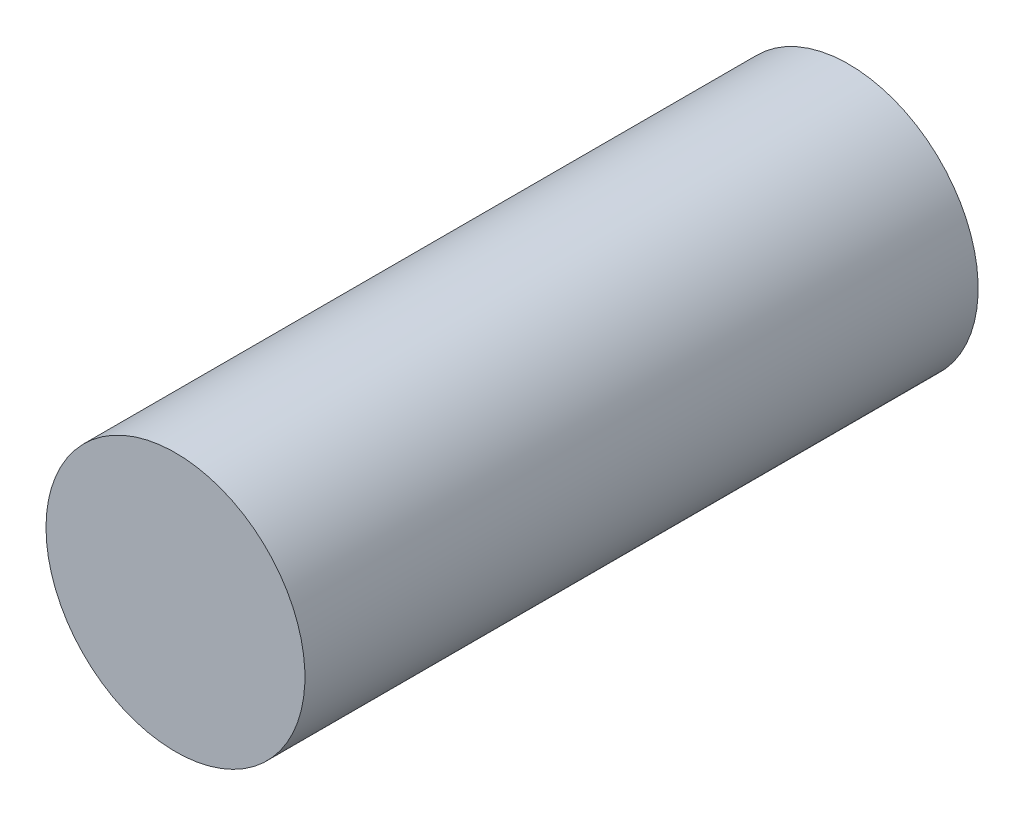
ISO-10303-21;
HEADER;
FILE_DESCRIPTION(('STEP AP214'),'2;1');
FILE_NAME('part.step','',(''),(''),'','','');
FILE_SCHEMA(('AUTOMOTIVE_DESIGN { 1 0 10303 214 1 1 1 1 }'));
ENDSEC;
DATA;
#1=APPLICATION_CONTEXT('core data for automotive mechanical design processes');
#2=APPLICATION_PROTOCOL_DEFINITION('international standard','automotive_design',2000,#1);
#3=PRODUCT_CONTEXT('',#1,'mechanical');
#4=PRODUCT('Part','Part','',(#3));
#5=PRODUCT_RELATED_PRODUCT_CATEGORY('part','',(#4));
#6=PRODUCT_DEFINITION_FORMATION('','',#4);
#7=PRODUCT_DEFINITION_CONTEXT('part definition',#1,'design');
#8=PRODUCT_DEFINITION('design','',#6,#7);
#9=PRODUCT_DEFINITION_SHAPE('','',#8);
#10=(LENGTH_UNIT() NAMED_UNIT(*) SI_UNIT(.MILLI.,.METRE.));
#11=(NAMED_UNIT(*) PLANE_ANGLE_UNIT() SI_UNIT($,.RADIAN.));
#12=(NAMED_UNIT(*) SI_UNIT($,.STERADIAN.) SOLID_ANGLE_UNIT());
#13=UNCERTAINTY_MEASURE_WITH_UNIT(LENGTH_MEASURE(1.E-05),#10,'distance_accuracy_value','');
#14=(GEOMETRIC_REPRESENTATION_CONTEXT(3) GLOBAL_UNCERTAINTY_ASSIGNED_CONTEXT((#13)) GLOBAL_UNIT_ASSIGNED_CONTEXT((#10,
#11,#12)) REPRESENTATION_CONTEXT('',''));
#15=CARTESIAN_POINT('',(0.,0.,0.));
#16=DIRECTION('',(0.,0.,1.));
#17=DIRECTION('',(1.,0.,0.));
#18=AXIS2_PLACEMENT_3D('',#15,#16,#17);
#19=CARTESIAN_POINT('',(0.,0.,13.));
#20=DIRECTION('',(0.,0.,-1.));
#21=DIRECTION('',(-1.,0.,0.));
#22=AXIS2_PLACEMENT_3D('',#19,#20,#21);
#23=CYLINDRICAL_SURFACE('',#22,2.5);
#24=CARTESIAN_POINT('',(0.,0.,13.));
#25=DIRECTION('',(0.,0.,1.));
#26=DIRECTION('',(1.,0.,0.));
#27=AXIS2_PLACEMENT_3D('',#24,#25,#26);
#28=CIRCLE('',#27,2.5);
#29=CARTESIAN_POINT('',(-2.5,0.,13.));
#30=VERTEX_POINT('',#29);
#31=EDGE_CURVE('E10',#30,#30,#28,.T.);
#32=CARTESIAN_POINT('',(0.,0.,0.));
#33=DIRECTION('',(0.,0.,1.));
#34=DIRECTION('',(1.,0.,0.));
#35=AXIS2_PLACEMENT_3D('',#32,#33,#34);
#36=CIRCLE('',#35,2.5);
#37=CARTESIAN_POINT('',(-2.5,0.,0.));
#38=VERTEX_POINT('',#37);
#39=EDGE_CURVE('E42',#38,#38,#36,.T.);
#40=CARTESIAN_POINT('',(-2.5,0.,13.));
#41=CARTESIAN_POINT('',(-2.5,0.,12.8645833333333));
#42=CARTESIAN_POINT('',(-2.5,0.,12.7291666666667));
#43=CARTESIAN_POINT('',(-2.5,0.,12.4583333333333));
#44=CARTESIAN_POINT('',(-2.5,0.,12.3229166666667));
#45=CARTESIAN_POINT('',(-2.5,0.,12.0520833333333));
#46=CARTESIAN_POINT('',(-2.5,0.,11.9166666666667));
#47=CARTESIAN_POINT('',(-2.5,0.,11.6458333333333));
#48=CARTESIAN_POINT('',(-2.5,0.,11.5104166666667));
#49=CARTESIAN_POINT('',(-2.5,0.,11.2395833333333));
#50=CARTESIAN_POINT('',(-2.5,0.,11.1041666666667));
#51=CARTESIAN_POINT('',(-2.5,0.,10.8333333333333));
#52=CARTESIAN_POINT('',(-2.5,0.,10.6979166666667));
#53=CARTESIAN_POINT('',(-2.5,0.,10.4270833333333));
#54=CARTESIAN_POINT('',(-2.5,0.,10.2916666666667));
#55=CARTESIAN_POINT('',(-2.5,0.,10.0208333333333));
#56=CARTESIAN_POINT('',(-2.5,0.,9.88541666666667));
#57=CARTESIAN_POINT('',(-2.5,0.,9.61458333333333));
#58=CARTESIAN_POINT('',(-2.5,0.,9.47916666666667));
#59=CARTESIAN_POINT('',(-2.5,0.,9.20833333333333));
#60=CARTESIAN_POINT('',(-2.5,0.,9.07291666666667));
#61=CARTESIAN_POINT('',(-2.5,0.,8.80208333333333));
#62=CARTESIAN_POINT('',(-2.5,0.,8.66666666666667));
#63=CARTESIAN_POINT('',(-2.5,0.,8.39583333333333));
#64=CARTESIAN_POINT('',(-2.5,0.,8.26041666666667));
#65=CARTESIAN_POINT('',(-2.5,0.,7.98958333333333));
#66=CARTESIAN_POINT('',(-2.5,0.,7.85416666666667));
#67=CARTESIAN_POINT('',(-2.5,0.,7.58333333333333));
#68=CARTESIAN_POINT('',(-2.5,0.,7.44791666666667));
#69=CARTESIAN_POINT('',(-2.5,0.,7.17708333333333));
#70=CARTESIAN_POINT('',(-2.5,0.,7.04166666666667));
#71=CARTESIAN_POINT('',(-2.5,0.,6.77083333333333));
#72=CARTESIAN_POINT('',(-2.5,0.,6.63541666666667));
#73=CARTESIAN_POINT('',(-2.5,0.,6.36458333333333));
#74=CARTESIAN_POINT('',(-2.5,0.,6.22916666666667));
#75=CARTESIAN_POINT('',(-2.5,0.,5.95833333333333));
#76=CARTESIAN_POINT('',(-2.5,0.,5.82291666666667));
#77=CARTESIAN_POINT('',(-2.5,0.,5.55208333333333));
#78=CARTESIAN_POINT('',(-2.5,0.,5.41666666666667));
#79=CARTESIAN_POINT('',(-2.5,0.,5.14583333333333));
#80=CARTESIAN_POINT('',(-2.5,0.,5.01041666666667));
#81=CARTESIAN_POINT('',(-2.5,0.,4.73958333333333));
#82=CARTESIAN_POINT('',(-2.5,0.,4.60416666666667));
#83=CARTESIAN_POINT('',(-2.5,0.,4.33333333333333));
#84=CARTESIAN_POINT('',(-2.5,0.,4.19791666666667));
#85=CARTESIAN_POINT('',(-2.5,0.,3.92708333333333));
#86=CARTESIAN_POINT('',(-2.5,0.,3.79166666666667));
#87=CARTESIAN_POINT('',(-2.5,0.,3.52083333333333));
#88=CARTESIAN_POINT('',(-2.5,0.,3.38541666666667));
#89=CARTESIAN_POINT('',(-2.5,0.,3.11458333333333));
#90=CARTESIAN_POINT('',(-2.5,0.,2.97916666666667));
#91=CARTESIAN_POINT('',(-2.5,0.,2.70833333333333));
#92=CARTESIAN_POINT('',(-2.5,0.,2.57291666666667));
#93=CARTESIAN_POINT('',(-2.5,0.,2.30208333333333));
#94=CARTESIAN_POINT('',(-2.5,0.,2.16666666666667));
#95=CARTESIAN_POINT('',(-2.5,0.,1.89583333333333));
#96=CARTESIAN_POINT('',(-2.5,0.,1.76041666666667));
#97=CARTESIAN_POINT('',(-2.5,0.,1.48958333333333));
#98=CARTESIAN_POINT('',(-2.5,0.,1.35416666666667));
#99=CARTESIAN_POINT('',(-2.5,0.,1.08333333333333));
#100=CARTESIAN_POINT('',(-2.5,0.,0.947916666666667));
#101=CARTESIAN_POINT('',(-2.5,0.,0.677083333333334));
#102=CARTESIAN_POINT('',(-2.5,0.,0.541666666666667));
#103=CARTESIAN_POINT('',(-2.5,0.,0.270833333333334));
#104=CARTESIAN_POINT('',(-2.5,0.,0.135416666666667));
#105=CARTESIAN_POINT('',(-2.5,0.,0.));
#106=B_SPLINE_CURVE_WITH_KNOTS('',3,(#40,#41,#42,#43,#44,#45,#46,#47,#48,#49,#50,#51,#52,#53,
#54,#55,#56,#57,#58,#59,#60,#61,#62,#63,#64,#65,#66,#67,#68,#69,#70,#71,#72,#73,#74,#75,#76,#77,
#78,#79,#80,#81,#82,#83,#84,#85,#86,#87,#88,#89,#90,#91,#92,#93,#94,#95,#96,#97,#98,#99,#100,
#101,#102,#103,#104,#105),.UNSPECIFIED.,.F.,.F.,(4,2,2,2,2,2,2,2,2,2,2,2,2,2,2,2,2,2,2,2,2,2,2,
2,2,2,2,2,2,2,2,2,4),(0.,0.406249999999999,0.812499999999999,1.21875,1.625,2.03125,2.4375,
2.84375,3.25,3.65625,4.0625,4.46875,4.875,5.28125,5.6875,6.09375,6.5,6.90625,7.3125,7.71875,
8.125,8.53125,8.9375,9.34375,9.75,10.15625,10.5625,10.96875,11.375,11.78125,12.1875,12.59375,
13.),.UNSPECIFIED.);
#107=EDGE_CURVE('BSEAM39',#30,#38,#106,.T.);
#108=ORIENTED_EDGE('',*,*,#31,.F.);
#109=ORIENTED_EDGE('',*,*,#39,.T.);
#110=ORIENTED_EDGE('',*,*,#107,.T.);
#111=ORIENTED_EDGE('',*,*,#107,.F.);
#112=EDGE_LOOP('',(#108,#110,#109,#111));
#113=FACE_BOUND('',#112,.T.);
#114=ADVANCED_FACE('F39',(#113),#23,.T.);
#115=CARTESIAN_POINT('',(0.,0.,13.));
#116=DIRECTION('',(0.,0.,1.));
#117=DIRECTION('',(1.,0.,0.));
#118=AXIS2_PLACEMENT_3D('',#115,#116,#117);
#119=PLANE('',#118);
#120=ORIENTED_EDGE('',*,*,#31,.T.);
#121=EDGE_LOOP('',(#120));
#122=FACE_BOUND('',#121,.T.);
#123=ADVANCED_FACE('F54',(#122),#119,.T.);
#124=CARTESIAN_POINT('',(0.,0.,0.));
#125=DIRECTION('',(0.,0.,1.));
#126=DIRECTION('',(1.,0.,0.));
#127=AXIS2_PLACEMENT_3D('',#124,#125,#126);
#128=PLANE('',#127);
#129=ORIENTED_EDGE('',*,*,#39,.F.);
#130=EDGE_LOOP('',(#129));
#131=FACE_BOUND('',#130,.T.);
#132=ADVANCED_FACE('F52',(#131),#128,.F.);
#133=CLOSED_SHELL('',(#114,#123,#132));
#134=MANIFOLD_SOLID_BREP('B2',#133);
#135=ADVANCED_BREP_SHAPE_REPRESENTATION('',(#18,#134),#14);
#136=SHAPE_DEFINITION_REPRESENTATION(#9,#135);
ENDSEC;
END-ISO-10303-21;
